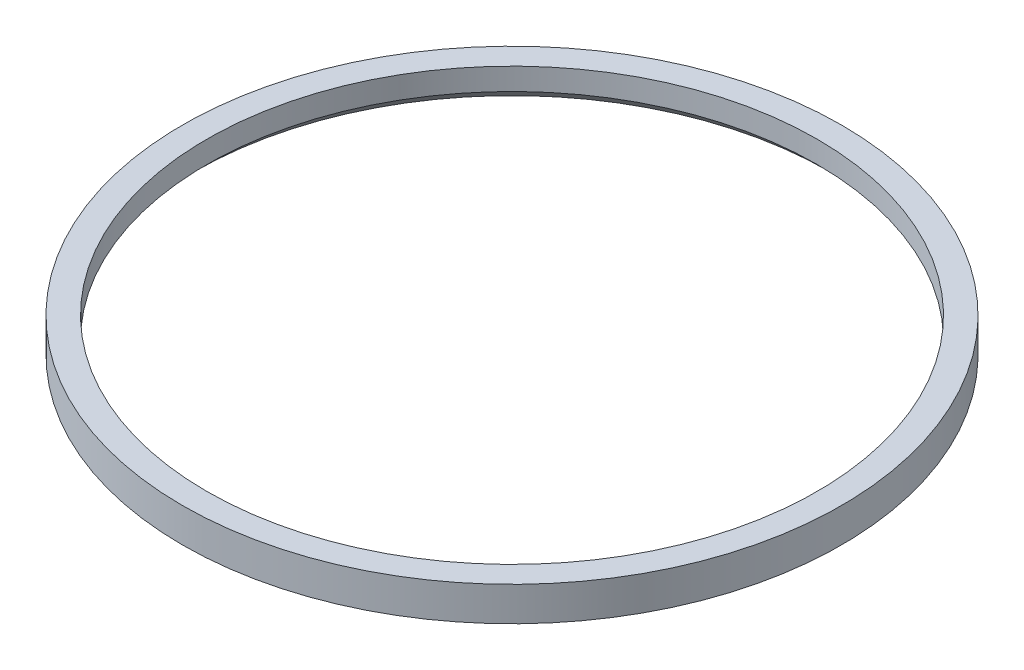
ISO-10303-21;
HEADER;
FILE_DESCRIPTION(('STEP AP214'),'2;1');
FILE_NAME('part.step','',(''),(''),'','','');
FILE_SCHEMA(('AUTOMOTIVE_DESIGN { 1 0 10303 214 1 1 1 1 }'));
ENDSEC;
DATA;
#1=APPLICATION_CONTEXT('core data for automotive mechanical design processes');
#2=APPLICATION_PROTOCOL_DEFINITION('international standard','automotive_design',2000,#1);
#3=PRODUCT_CONTEXT('',#1,'mechanical');
#4=PRODUCT('Part','Part','',(#3));
#5=PRODUCT_RELATED_PRODUCT_CATEGORY('part','',(#4));
#6=PRODUCT_DEFINITION_FORMATION('','',#4);
#7=PRODUCT_DEFINITION_CONTEXT('part definition',#1,'design');
#8=PRODUCT_DEFINITION('design','',#6,#7);
#9=PRODUCT_DEFINITION_SHAPE('','',#8);
#10=(LENGTH_UNIT() NAMED_UNIT(*) SI_UNIT(.MILLI.,.METRE.));
#11=(NAMED_UNIT(*) PLANE_ANGLE_UNIT() SI_UNIT($,.RADIAN.));
#12=(NAMED_UNIT(*) SI_UNIT($,.STERADIAN.) SOLID_ANGLE_UNIT());
#13=UNCERTAINTY_MEASURE_WITH_UNIT(LENGTH_MEASURE(1.E-05),#10,'distance_accuracy_value','');
#14=(GEOMETRIC_REPRESENTATION_CONTEXT(3) GLOBAL_UNCERTAINTY_ASSIGNED_CONTEXT((#13)) GLOBAL_UNIT_ASSIGNED_CONTEXT((#10,
#11,#12)) REPRESENTATION_CONTEXT('',''));
#15=CARTESIAN_POINT('',(0.,0.,0.));
#16=DIRECTION('',(0.,0.,1.));
#17=DIRECTION('',(1.,0.,0.));
#18=AXIS2_PLACEMENT_3D('',#15,#16,#17);
#19=CARTESIAN_POINT('',(13.5,0.514576604618856,0.));
#20=DIRECTION('',(0.,-1.,0.));
#21=DIRECTION('',(0.,0.,-1.));
#22=AXIS2_PLACEMENT_3D('',#19,#20,#21);
#23=PLANE('',#22);
#24=CARTESIAN_POINT('',(0.,0.514576604618856,0.));
#25=DIRECTION('',(0.,-1.,0.));
#26=DIRECTION('',(0.,0.,-1.));
#27=AXIS2_PLACEMENT_3D('',#24,#25,#26);
#28=CIRCLE('',#27,13.5);
#29=CARTESIAN_POINT('',(0.,0.514576604618856,-13.5));
#30=VERTEX_POINT('',#29);
#31=EDGE_CURVE('E60',#30,#30,#28,.T.);
#32=ORIENTED_EDGE('',*,*,#31,.T.);
#33=EDGE_LOOP('',(#32));
#34=FACE_BOUND('',#33,.T.);
#35=CARTESIAN_POINT('',(0.,0.514576604618856,0.));
#36=DIRECTION('',(0.,-1.,0.));
#37=DIRECTION('',(0.,0.,-1.));
#38=AXIS2_PLACEMENT_3D('',#35,#36,#37);
#39=CIRCLE('',#38,13.);
#40=CARTESIAN_POINT('',(0.,0.514576604618856,-13.));
#41=VERTEX_POINT('',#40);
#42=EDGE_CURVE('E10',#41,#41,#39,.T.);
#43=ORIENTED_EDGE('',*,*,#42,.F.);
#44=EDGE_LOOP('',(#43));
#45=FACE_BOUND('',#44,.T.);
#46=ADVANCED_FACE('F37',(#34,#45),#23,.T.);
#47=CARTESIAN_POINT('',(0.,1.01457660461886,0.));
#48=DIRECTION('',(0.,-1.,0.));
#49=DIRECTION('',(0.,0.,-1.));
#50=AXIS2_PLACEMENT_3D('',#47,#48,#49);
#51=CONICAL_SURFACE('',#50,12.5,0.785398163397445);
#52=ORIENTED_EDGE('',*,*,#42,.T.);
#53=EDGE_LOOP('',(#52));
#54=FACE_BOUND('',#53,.T.);
#55=CARTESIAN_POINT('',(0.,1.01457660461886,0.));
#56=DIRECTION('',(0.,-1.,0.));
#57=DIRECTION('',(0.,0.,-1.));
#58=AXIS2_PLACEMENT_3D('',#55,#56,#57);
#59=CIRCLE('',#58,12.5);
#60=CARTESIAN_POINT('',(0.,1.01457660461886,-12.5));
#61=VERTEX_POINT('',#60);
#62=EDGE_CURVE('E44',#61,#61,#59,.T.);
#63=ORIENTED_EDGE('',*,*,#62,.F.);
#64=EDGE_LOOP('',(#63));
#65=FACE_BOUND('',#64,.T.);
#66=ADVANCED_FACE('F79',(#54,#65),#51,.F.);
#67=CARTESIAN_POINT('',(0.,0.,0.));
#68=DIRECTION('',(0.,-1.,0.));
#69=DIRECTION('',(0.,0.,-1.));
#70=AXIS2_PLACEMENT_3D('',#67,#68,#69);
#71=CYLINDRICAL_SURFACE('',#70,12.5);
#72=ORIENTED_EDGE('',*,*,#62,.T.);
#73=EDGE_LOOP('',(#72));
#74=FACE_BOUND('',#73,.T.);
#75=CARTESIAN_POINT('',(0.,1.91457660461886,0.));
#76=DIRECTION('',(0.,-1.,0.));
#77=DIRECTION('',(0.,0.,-1.));
#78=AXIS2_PLACEMENT_3D('',#75,#76,#77);
#79=CIRCLE('',#78,12.5);
#80=CARTESIAN_POINT('',(0.,1.91457660461886,-12.5));
#81=VERTEX_POINT('',#80);
#82=EDGE_CURVE('E49',#81,#81,#79,.T.);
#83=ORIENTED_EDGE('',*,*,#82,.F.);
#84=EDGE_LOOP('',(#83));
#85=FACE_BOUND('',#84,.T.);
#86=ADVANCED_FACE('F75',(#74,#85),#71,.F.);
#87=CARTESIAN_POINT('',(12.5,1.91457660461886,0.));
#88=DIRECTION('',(0.,1.,0.));
#89=DIRECTION('',(0.,0.,1.));
#90=AXIS2_PLACEMENT_3D('',#87,#88,#89);
#91=PLANE('',#90);
#92=ORIENTED_EDGE('',*,*,#82,.T.);
#93=EDGE_LOOP('',(#92));
#94=FACE_BOUND('',#93,.T.);
#95=CARTESIAN_POINT('',(0.,1.91457660461886,0.));
#96=DIRECTION('',(0.,-1.,0.));
#97=DIRECTION('',(0.,0.,-1.));
#98=AXIS2_PLACEMENT_3D('',#95,#96,#97);
#99=CIRCLE('',#98,13.5);
#100=CARTESIAN_POINT('',(0.,1.91457660461886,-13.5));
#101=VERTEX_POINT('',#100);
#102=EDGE_CURVE('E54',#101,#101,#99,.T.);
#103=ORIENTED_EDGE('',*,*,#102,.F.);
#104=EDGE_LOOP('',(#103));
#105=FACE_BOUND('',#104,.T.);
#106=ADVANCED_FACE('F69',(#94,#105),#91,.T.);
#107=CARTESIAN_POINT('',(0.,0.,0.));
#108=DIRECTION('',(0.,-1.,0.));
#109=DIRECTION('',(0.,0.,-1.));
#110=AXIS2_PLACEMENT_3D('',#107,#108,#109);
#111=CYLINDRICAL_SURFACE('',#110,13.5);
#112=ORIENTED_EDGE('',*,*,#102,.T.);
#113=EDGE_LOOP('',(#112));
#114=FACE_BOUND('',#113,.T.);
#115=ORIENTED_EDGE('',*,*,#31,.F.);
#116=EDGE_LOOP('',(#115));
#117=FACE_BOUND('',#116,.T.);
#118=ADVANCED_FACE('F67',(#114,#117),#111,.T.);
#119=CLOSED_SHELL('',(#46,#66,#86,#106,#118));
#120=MANIFOLD_SOLID_BREP('B2',#119);
#121=ADVANCED_BREP_SHAPE_REPRESENTATION('',(#18,#120),#14);
#122=SHAPE_DEFINITION_REPRESENTATION(#9,#121);
ENDSEC;
END-ISO-10303-21;
